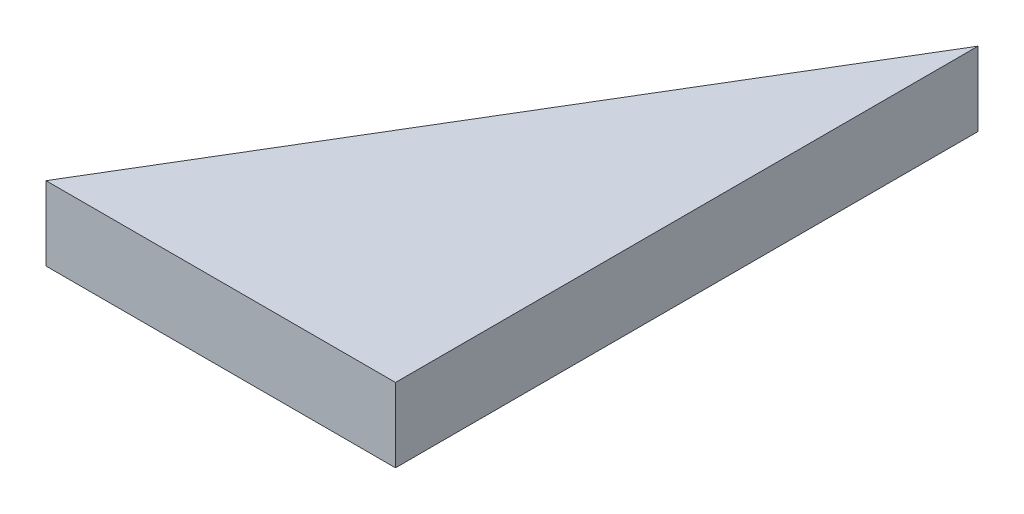
ISO-10303-21;
HEADER;
FILE_DESCRIPTION(('STEP AP214'),'2;1');
FILE_NAME('part.step','',(''),(''),'','','');
FILE_SCHEMA(('AUTOMOTIVE_DESIGN { 1 0 10303 214 1 1 1 1 }'));
ENDSEC;
DATA;
#1=APPLICATION_CONTEXT('core data for automotive mechanical design processes');
#2=APPLICATION_PROTOCOL_DEFINITION('international standard','automotive_design',2000,#1);
#3=PRODUCT_CONTEXT('',#1,'mechanical');
#4=PRODUCT('Part','Part','',(#3));
#5=PRODUCT_RELATED_PRODUCT_CATEGORY('part','',(#4));
#6=PRODUCT_DEFINITION_FORMATION('','',#4);
#7=PRODUCT_DEFINITION_CONTEXT('part definition',#1,'design');
#8=PRODUCT_DEFINITION('design','',#6,#7);
#9=PRODUCT_DEFINITION_SHAPE('','',#8);
#10=(LENGTH_UNIT() NAMED_UNIT(*) SI_UNIT(.MILLI.,.METRE.));
#11=(NAMED_UNIT(*) PLANE_ANGLE_UNIT() SI_UNIT($,.RADIAN.));
#12=(NAMED_UNIT(*) SI_UNIT($,.STERADIAN.) SOLID_ANGLE_UNIT());
#13=UNCERTAINTY_MEASURE_WITH_UNIT(LENGTH_MEASURE(1.E-05),#10,'distance_accuracy_value','');
#14=(GEOMETRIC_REPRESENTATION_CONTEXT(3) GLOBAL_UNCERTAINTY_ASSIGNED_CONTEXT((#13)) GLOBAL_UNIT_ASSIGNED_CONTEXT((#10,
#11,#12)) REPRESENTATION_CONTEXT('',''));
#15=CARTESIAN_POINT('',(0.,0.,0.));
#16=DIRECTION('',(0.,0.,1.));
#17=DIRECTION('',(1.,0.,0.));
#18=AXIS2_PLACEMENT_3D('',#15,#16,#17);
#19=CARTESIAN_POINT('',(0.,6.35,-50.));
#20=DIRECTION('',(0.857492925712544,0.,0.514495755427526));
#21=DIRECTION('',(0.514495755427526,0.,-0.857492925712544));
#22=AXIS2_PLACEMENT_3D('',#19,#20,#21);
#23=PLANE('',#22);
#24=DIRECTION('',(-0.514495755427526,0.,0.857492925712544));
#25=VECTOR('',#24,1.);
#26=CARTESIAN_POINT('',(0.,0.,-50.));
#27=LINE('',#26,#25);
#28=CARTESIAN_POINT('',(0.,0.,-50.));
#29=VERTEX_POINT('',#28);
#30=CARTESIAN_POINT('',(-30.,0.,0.));
#31=VERTEX_POINT('',#30);
#32=EDGE_CURVE('E89',#29,#31,#27,.T.);
#33=ORIENTED_EDGE('',*,*,#32,.T.);
#34=DIRECTION('',(0.,-1.,0.));
#35=VECTOR('',#34,1.);
#36=CARTESIAN_POINT('',(-30.,6.35,0.));
#37=LINE('',#36,#35);
#38=CARTESIAN_POINT('',(-30.,6.35,0.));
#39=VERTEX_POINT('',#38);
#40=EDGE_CURVE('E11',#39,#31,#37,.T.);
#41=ORIENTED_EDGE('',*,*,#40,.F.);
#42=DIRECTION('',(-0.514495755427526,0.,0.857492925712544));
#43=VECTOR('',#42,1.);
#44=CARTESIAN_POINT('',(0.,6.35,-50.));
#45=LINE('',#44,#43);
#46=CARTESIAN_POINT('',(0.,6.35,-50.));
#47=VERTEX_POINT('',#46);
#48=EDGE_CURVE('E81',#47,#39,#45,.T.);
#49=ORIENTED_EDGE('',*,*,#48,.F.);
#50=DIRECTION('',(0.,-1.,0.));
#51=VECTOR('',#50,1.);
#52=CARTESIAN_POINT('',(0.,6.35,-50.));
#53=LINE('',#52,#51);
#54=EDGE_CURVE('E90',#47,#29,#53,.T.);
#55=ORIENTED_EDGE('',*,*,#54,.T.);
#56=EDGE_LOOP('',(#33,#41,#49,#55));
#57=FACE_BOUND('',#56,.T.);
#58=ADVANCED_FACE('F39',(#57),#23,.F.);
#59=CARTESIAN_POINT('',(-30.,6.35,0.));
#60=DIRECTION('',(0.,0.,-1.));
#61=DIRECTION('',(-1.,0.,0.));
#62=AXIS2_PLACEMENT_3D('',#59,#60,#61);
#63=PLANE('',#62);
#64=DIRECTION('',(1.,0.,0.));
#65=VECTOR('',#64,1.);
#66=CARTESIAN_POINT('',(-30.,0.,0.));
#67=LINE('',#66,#65);
#68=CARTESIAN_POINT('',(0.,0.,0.));
#69=VERTEX_POINT('',#68);
#70=EDGE_CURVE('E68',#31,#69,#67,.T.);
#71=ORIENTED_EDGE('',*,*,#70,.T.);
#72=DIRECTION('',(0.,-1.,0.));
#73=VECTOR('',#72,1.);
#74=CARTESIAN_POINT('',(0.,6.35,0.));
#75=LINE('',#74,#73);
#76=CARTESIAN_POINT('',(0.,6.35,0.));
#77=VERTEX_POINT('',#76);
#78=EDGE_CURVE('E48',#77,#69,#75,.T.);
#79=ORIENTED_EDGE('',*,*,#78,.F.);
#80=DIRECTION('',(1.,0.,0.));
#81=VECTOR('',#80,1.);
#82=CARTESIAN_POINT('',(-30.,6.35,0.));
#83=LINE('',#82,#81);
#84=EDGE_CURVE('E76',#39,#77,#83,.T.);
#85=ORIENTED_EDGE('',*,*,#84,.F.);
#86=ORIENTED_EDGE('',*,*,#40,.T.);
#87=EDGE_LOOP('',(#71,#79,#85,#86));
#88=FACE_BOUND('',#87,.T.);
#89=ADVANCED_FACE('F77',(#88),#63,.F.);
#90=CARTESIAN_POINT('',(0.,6.35,0.));
#91=DIRECTION('',(-1.,0.,0.));
#92=DIRECTION('',(0.,0.,1.));
#93=AXIS2_PLACEMENT_3D('',#90,#91,#92);
#94=PLANE('',#93);
#95=DIRECTION('',(0.,0.,-1.));
#96=VECTOR('',#95,1.);
#97=CARTESIAN_POINT('',(0.,0.,0.));
#98=LINE('',#97,#96);
#99=EDGE_CURVE('E73',#69,#29,#98,.T.);
#100=ORIENTED_EDGE('',*,*,#99,.T.);
#101=ORIENTED_EDGE('',*,*,#54,.F.);
#102=DIRECTION('',(0.,0.,-1.));
#103=VECTOR('',#102,1.);
#104=CARTESIAN_POINT('',(0.,6.35,0.));
#105=LINE('',#104,#103);
#106=EDGE_CURVE('E56',#77,#47,#105,.T.);
#107=ORIENTED_EDGE('',*,*,#106,.F.);
#108=ORIENTED_EDGE('',*,*,#78,.T.);
#109=EDGE_LOOP('',(#100,#101,#107,#108));
#110=FACE_BOUND('',#109,.T.);
#111=ADVANCED_FACE('F102',(#110),#94,.F.);
#112=CARTESIAN_POINT('',(0.,6.35,0.));
#113=DIRECTION('',(0.,1.,0.));
#114=DIRECTION('',(0.,0.,1.));
#115=AXIS2_PLACEMENT_3D('',#112,#113,#114);
#116=PLANE('',#115);
#117=ORIENTED_EDGE('',*,*,#48,.T.);
#118=ORIENTED_EDGE('',*,*,#84,.T.);
#119=ORIENTED_EDGE('',*,*,#106,.T.);
#120=EDGE_LOOP('',(#117,#118,#119));
#121=FACE_BOUND('',#120,.T.);
#122=ADVANCED_FACE('F84',(#121),#116,.T.);
#123=CARTESIAN_POINT('',(0.,0.,0.));
#124=DIRECTION('',(0.,1.,0.));
#125=DIRECTION('',(0.,0.,1.));
#126=AXIS2_PLACEMENT_3D('',#123,#124,#125);
#127=PLANE('',#126);
#128=ORIENTED_EDGE('',*,*,#32,.F.);
#129=ORIENTED_EDGE('',*,*,#99,.F.);
#130=ORIENTED_EDGE('',*,*,#70,.F.);
#131=EDGE_LOOP('',(#128,#129,#130));
#132=FACE_BOUND('',#131,.T.);
#133=ADVANCED_FACE('F103',(#132),#127,.F.);
#134=CLOSED_SHELL('',(#58,#89,#111,#122,#133));
#135=MANIFOLD_SOLID_BREP('B2',#134);
#136=ADVANCED_BREP_SHAPE_REPRESENTATION('',(#18,#135),#14);
#137=SHAPE_DEFINITION_REPRESENTATION(#9,#136);
ENDSEC;
END-ISO-10303-21;
